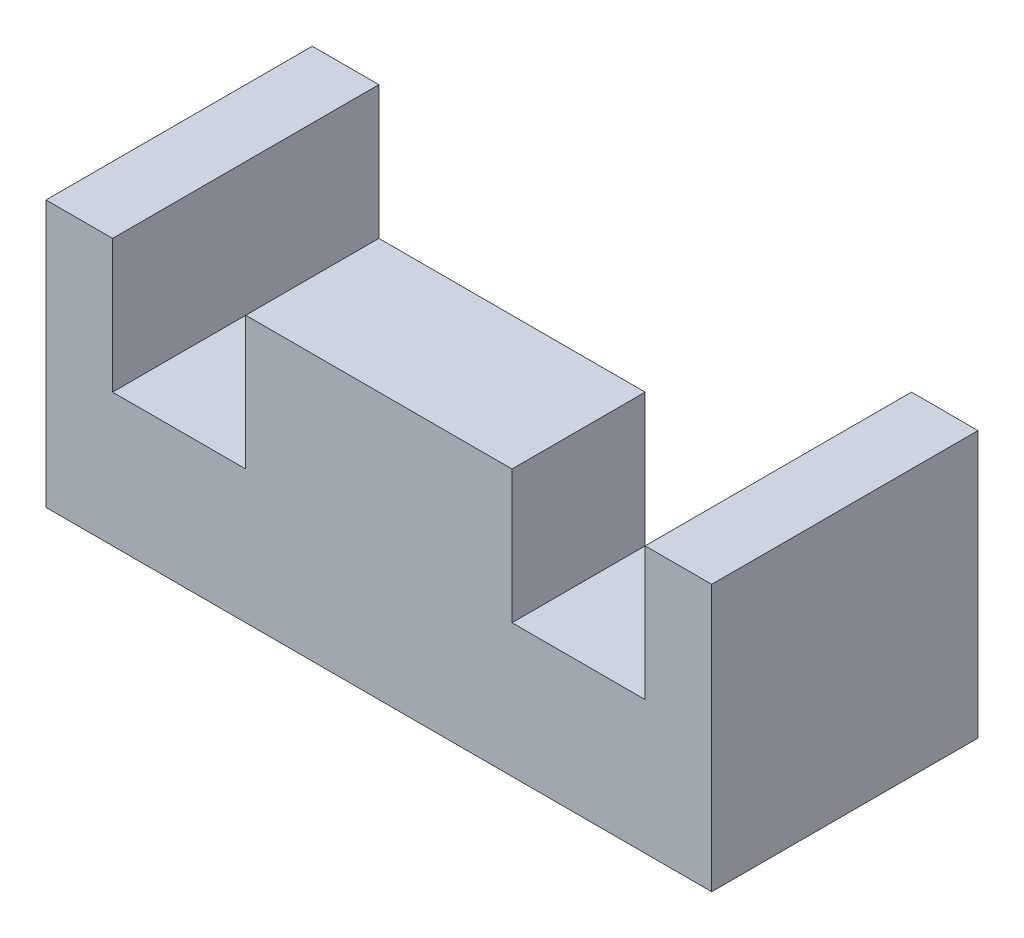
ISO-10303-21;
HEADER;
FILE_DESCRIPTION(('STEP AP214'),'2;1');
FILE_NAME('part.step','',(''),(''),'','','');
FILE_SCHEMA(('AUTOMOTIVE_DESIGN { 1 0 10303 214 1 1 1 1 }'));
ENDSEC;
DATA;
#1=APPLICATION_CONTEXT('core data for automotive mechanical design processes');
#2=APPLICATION_PROTOCOL_DEFINITION('international standard','automotive_design',2000,#1);
#3=PRODUCT_CONTEXT('',#1,'mechanical');
#4=PRODUCT('Part','Part','',(#3));
#5=PRODUCT_RELATED_PRODUCT_CATEGORY('part','',(#4));
#6=PRODUCT_DEFINITION_FORMATION('','',#4);
#7=PRODUCT_DEFINITION_CONTEXT('part definition',#1,'design');
#8=PRODUCT_DEFINITION('design','',#6,#7);
#9=PRODUCT_DEFINITION_SHAPE('','',#8);
#10=(LENGTH_UNIT() NAMED_UNIT(*) SI_UNIT(.MILLI.,.METRE.));
#11=(NAMED_UNIT(*) PLANE_ANGLE_UNIT() SI_UNIT($,.RADIAN.));
#12=(NAMED_UNIT(*) SI_UNIT($,.STERADIAN.) SOLID_ANGLE_UNIT());
#13=UNCERTAINTY_MEASURE_WITH_UNIT(LENGTH_MEASURE(1.E-05),#10,'distance_accuracy_value','');
#14=(GEOMETRIC_REPRESENTATION_CONTEXT(3) GLOBAL_UNCERTAINTY_ASSIGNED_CONTEXT((#13)) GLOBAL_UNIT_ASSIGNED_CONTEXT((#10,
#11,#12)) REPRESENTATION_CONTEXT('',''));
#15=CARTESIAN_POINT('',(0.,0.,0.));
#16=DIRECTION('',(0.,0.,1.));
#17=DIRECTION('',(1.,0.,0.));
#18=AXIS2_PLACEMENT_3D('',#15,#16,#17);
#19=CARTESIAN_POINT('',(0.,0.,0.));
#20=DIRECTION('',(0.,0.,1.));
#21=DIRECTION('',(1.,0.,0.));
#22=AXIS2_PLACEMENT_3D('',#19,#20,#21);
#23=PLANE('',#22);
#24=DIRECTION('',(1.,0.,0.));
#25=VECTOR('',#24,1.);
#26=CARTESIAN_POINT('',(0.,0.,0.));
#27=LINE('',#26,#25);
#28=CARTESIAN_POINT('',(-20.,0.,0.));
#29=VERTEX_POINT('',#28);
#30=CARTESIAN_POINT('',(-10.,0.,0.));
#31=VERTEX_POINT('',#30);
#32=EDGE_CURVE('E176',#29,#31,#27,.T.);
#33=ORIENTED_EDGE('',*,*,#32,.T.);
#34=DIRECTION('',(0.,1.,0.));
#35=VECTOR('',#34,1.);
#36=CARTESIAN_POINT('',(-10.,10.,0.));
#37=LINE('',#36,#35);
#38=CARTESIAN_POINT('',(-10.,-10.,0.));
#39=VERTEX_POINT('',#38);
#40=EDGE_CURVE('E300',#39,#31,#37,.T.);
#41=ORIENTED_EDGE('',*,*,#40,.F.);
#42=DIRECTION('',(1.,0.,0.));
#43=VECTOR('',#42,1.);
#44=CARTESIAN_POINT('',(0.,-10.,0.));
#45=LINE('',#44,#43);
#46=CARTESIAN_POINT('',(-25.,-10.,0.));
#47=VERTEX_POINT('',#46);
#48=EDGE_CURVE('E186',#47,#39,#45,.T.);
#49=ORIENTED_EDGE('',*,*,#48,.F.);
#50=DIRECTION('',(0.,-1.,0.));
#51=VECTOR('',#50,1.);
#52=CARTESIAN_POINT('',(-25.,0.,0.));
#53=LINE('',#52,#51);
#54=CARTESIAN_POINT('',(-25.,10.,0.));
#55=VERTEX_POINT('',#54);
#56=EDGE_CURVE('E148',#55,#47,#53,.T.);
#57=ORIENTED_EDGE('',*,*,#56,.F.);
#58=DIRECTION('',(1.,0.,0.));
#59=VECTOR('',#58,1.);
#60=CARTESIAN_POINT('',(0.,10.,0.));
#61=LINE('',#60,#59);
#62=CARTESIAN_POINT('',(-20.,10.,0.));
#63=VERTEX_POINT('',#62);
#64=EDGE_CURVE('E168',#55,#63,#61,.T.);
#65=ORIENTED_EDGE('',*,*,#64,.T.);
#66=DIRECTION('',(0.,-1.,0.));
#67=VECTOR('',#66,1.);
#68=CARTESIAN_POINT('',(-20.,0.,0.));
#69=LINE('',#68,#67);
#70=EDGE_CURVE('E180',#63,#29,#69,.T.);
#71=ORIENTED_EDGE('',*,*,#70,.T.);
#72=EDGE_LOOP('',(#33,#41,#49,#57,#65,#71));
#73=FACE_BOUND('',#72,.T.);
#74=ADVANCED_FACE('F40',(#73),#23,.F.);
#75=CARTESIAN_POINT('',(0.,10.,20.));
#76=DIRECTION('',(0.,1.,0.));
#77=DIRECTION('',(0.,0.,1.));
#78=AXIS2_PLACEMENT_3D('',#75,#76,#77);
#79=PLANE('',#78);
#80=CARTESIAN_POINT('',(20.,10.,0.));
#81=VERTEX_POINT('',#80);
#82=CARTESIAN_POINT('',(25.,10.,0.));
#83=VERTEX_POINT('',#82);
#84=EDGE_CURVE('E163',#81,#83,#61,.T.);
#85=ORIENTED_EDGE('',*,*,#84,.F.);
#86=DIRECTION('',(0.,0.,-1.));
#87=VECTOR('',#86,1.);
#88=CARTESIAN_POINT('',(20.,10.,20.));
#89=LINE('',#88,#87);
#90=CARTESIAN_POINT('',(20.,10.,20.));
#91=VERTEX_POINT('',#90);
#92=EDGE_CURVE('E50',#91,#81,#89,.T.);
#93=ORIENTED_EDGE('',*,*,#92,.F.);
#94=DIRECTION('',(1.,0.,0.));
#95=VECTOR('',#94,1.);
#96=CARTESIAN_POINT('',(0.,10.,20.));
#97=LINE('',#96,#95);
#98=CARTESIAN_POINT('',(25.,10.,20.));
#99=VERTEX_POINT('',#98);
#100=EDGE_CURVE('E193',#91,#99,#97,.T.);
#101=ORIENTED_EDGE('',*,*,#100,.T.);
#102=DIRECTION('',(0.,0.,-1.));
#103=VECTOR('',#102,1.);
#104=CARTESIAN_POINT('',(25.,10.,20.));
#105=LINE('',#104,#103);
#106=EDGE_CURVE('E58',#99,#83,#105,.T.);
#107=ORIENTED_EDGE('',*,*,#106,.T.);
#108=EDGE_LOOP('',(#85,#93,#101,#107));
#109=FACE_BOUND('',#108,.T.);
#110=ADVANCED_FACE('F232',(#109),#79,.T.);
#111=CARTESIAN_POINT('',(20.,0.,20.));
#112=DIRECTION('',(1.,0.,0.));
#113=DIRECTION('',(0.,1.,0.));
#114=AXIS2_PLACEMENT_3D('',#111,#112,#113);
#115=PLANE('',#114);
#116=DIRECTION('',(0.,-1.,0.));
#117=VECTOR('',#116,1.);
#118=CARTESIAN_POINT('',(20.,0.,0.));
#119=LINE('',#118,#117);
#120=CARTESIAN_POINT('',(20.,0.,0.));
#121=VERTEX_POINT('',#120);
#122=EDGE_CURVE('E166',#81,#121,#119,.T.);
#123=ORIENTED_EDGE('',*,*,#122,.T.);
#124=DIRECTION('',(0.,0.,-1.));
#125=VECTOR('',#124,1.);
#126=CARTESIAN_POINT('',(20.,0.,20.));
#127=LINE('',#126,#125);
#128=CARTESIAN_POINT('',(20.,0.,20.));
#129=VERTEX_POINT('',#128);
#130=EDGE_CURVE('E222',#129,#121,#127,.T.);
#131=ORIENTED_EDGE('',*,*,#130,.F.);
#132=DIRECTION('',(0.,-1.,0.));
#133=VECTOR('',#132,1.);
#134=CARTESIAN_POINT('',(20.,0.,20.));
#135=LINE('',#134,#133);
#136=EDGE_CURVE('E228',#91,#129,#135,.T.);
#137=ORIENTED_EDGE('',*,*,#136,.F.);
#138=ORIENTED_EDGE('',*,*,#92,.T.);
#139=EDGE_LOOP('',(#123,#131,#137,#138));
#140=FACE_BOUND('',#139,.T.);
#141=ADVANCED_FACE('F42',(#140),#115,.F.);
#142=CARTESIAN_POINT('',(0.,0.,20.));
#143=DIRECTION('',(0.,1.,0.));
#144=DIRECTION('',(-1.,0.,0.));
#145=AXIS2_PLACEMENT_3D('',#142,#143,#144);
#146=PLANE('',#145);
#147=DIRECTION('',(1.,0.,0.));
#148=VECTOR('',#147,1.);
#149=CARTESIAN_POINT('',(0.,0.,0.));
#150=LINE('',#149,#148);
#151=CARTESIAN_POINT('',(9.99999999999999,0.,0.));
#152=VERTEX_POINT('',#151);
#153=EDGE_CURVE('E172',#152,#121,#150,.T.);
#154=ORIENTED_EDGE('',*,*,#153,.F.);
#155=DIRECTION('',(0.,0.,-1.));
#156=VECTOR('',#155,1.);
#157=CARTESIAN_POINT('',(9.99999999999998,0.,20.));
#158=LINE('',#157,#156);
#159=CARTESIAN_POINT('',(9.99999999999998,0.,10.));
#160=VERTEX_POINT('',#159);
#161=EDGE_CURVE('E267',#160,#152,#158,.T.);
#162=ORIENTED_EDGE('',*,*,#161,.F.);
#163=DIRECTION('',(0.,0.,-1.));
#164=VECTOR('',#163,1.);
#165=CARTESIAN_POINT('',(9.99999999999999,0.,20.));
#166=LINE('',#165,#164);
#167=CARTESIAN_POINT('',(9.99999999999999,0.,20.));
#168=VERTEX_POINT('',#167);
#169=EDGE_CURVE('E218',#168,#160,#166,.T.);
#170=ORIENTED_EDGE('',*,*,#169,.F.);
#171=DIRECTION('',(1.,0.,0.));
#172=VECTOR('',#171,1.);
#173=CARTESIAN_POINT('',(0.,0.,20.));
#174=LINE('',#173,#172);
#175=EDGE_CURVE('E313',#168,#129,#174,.T.);
#176=ORIENTED_EDGE('',*,*,#175,.T.);
#177=ORIENTED_EDGE('',*,*,#130,.T.);
#178=EDGE_LOOP('',(#154,#162,#170,#176,#177));
#179=FACE_BOUND('',#178,.T.);
#180=ADVANCED_FACE('F240',(#179),#146,.T.);
#181=CARTESIAN_POINT('',(9.99999999999999,0.,20.));
#182=DIRECTION('',(1.,0.,0.));
#183=DIRECTION('',(0.,1.,0.));
#184=AXIS2_PLACEMENT_3D('',#181,#182,#183);
#185=PLANE('',#184);
#186=DIRECTION('',(0.,-1.,0.));
#187=VECTOR('',#186,1.);
#188=CARTESIAN_POINT('',(9.99999999999998,10.,10.));
#189=LINE('',#188,#187);
#190=CARTESIAN_POINT('',(9.99999999999998,10.,10.));
#191=VERTEX_POINT('',#190);
#192=EDGE_CURVE('E281',#191,#160,#189,.T.);
#193=ORIENTED_EDGE('',*,*,#192,.F.);
#194=DIRECTION('',(0.,0.,-1.));
#195=VECTOR('',#194,1.);
#196=CARTESIAN_POINT('',(9.99999999999999,10.,20.));
#197=LINE('',#196,#195);
#198=CARTESIAN_POINT('',(9.99999999999999,10.,20.));
#199=VERTEX_POINT('',#198);
#200=EDGE_CURVE('E214',#199,#191,#197,.T.);
#201=ORIENTED_EDGE('',*,*,#200,.F.);
#202=DIRECTION('',(0.,-1.,0.));
#203=VECTOR('',#202,1.);
#204=CARTESIAN_POINT('',(9.99999999999999,0.,20.));
#205=LINE('',#204,#203);
#206=EDGE_CURVE('E317',#199,#168,#205,.T.);
#207=ORIENTED_EDGE('',*,*,#206,.T.);
#208=ORIENTED_EDGE('',*,*,#169,.T.);
#209=EDGE_LOOP('',(#193,#201,#207,#208));
#210=FACE_BOUND('',#209,.T.);
#211=ADVANCED_FACE('F248',(#210),#185,.T.);
#212=DIRECTION('',(1.,0.,0.));
#213=VECTOR('',#212,1.);
#214=CARTESIAN_POINT('',(-10.,10.,10.));
#215=LINE('',#214,#213);
#216=CARTESIAN_POINT('',(-10.,10.,10.));
#217=VERTEX_POINT('',#216);
#218=EDGE_CURVE('E289',#217,#191,#215,.T.);
#219=ORIENTED_EDGE('',*,*,#218,.F.);
#220=DIRECTION('',(0.,0.,-1.));
#221=VECTOR('',#220,1.);
#222=CARTESIAN_POINT('',(-10.,10.,20.));
#223=LINE('',#222,#221);
#224=CARTESIAN_POINT('',(-10.,10.,20.));
#225=VERTEX_POINT('',#224);
#226=EDGE_CURVE('E210',#225,#217,#223,.T.);
#227=ORIENTED_EDGE('',*,*,#226,.F.);
#228=EDGE_CURVE('E310',#225,#199,#97,.T.);
#229=ORIENTED_EDGE('',*,*,#228,.T.);
#230=ORIENTED_EDGE('',*,*,#200,.T.);
#231=EDGE_LOOP('',(#219,#227,#229,#230));
#232=FACE_BOUND('',#231,.T.);
#233=ADVANCED_FACE('F235',(#232),#79,.T.);
#234=CARTESIAN_POINT('',(-10.,0.,20.));
#235=DIRECTION('',(1.,0.,0.));
#236=DIRECTION('',(0.,1.,0.));
#237=AXIS2_PLACEMENT_3D('',#234,#235,#236);
#238=PLANE('',#237);
#239=ORIENTED_EDGE('',*,*,#226,.T.);
#240=DIRECTION('',(0.,1.,0.));
#241=VECTOR('',#240,1.);
#242=CARTESIAN_POINT('',(-10.,10.,10.));
#243=LINE('',#242,#241);
#244=CARTESIAN_POINT('',(-10.,0.,10.));
#245=VERTEX_POINT('',#244);
#246=EDGE_CURVE('E296',#245,#217,#243,.T.);
#247=ORIENTED_EDGE('',*,*,#246,.F.);
#248=DIRECTION('',(0.,0.,-1.));
#249=VECTOR('',#248,1.);
#250=CARTESIAN_POINT('',(-10.,0.,20.));
#251=LINE('',#250,#249);
#252=CARTESIAN_POINT('',(-10.,0.,20.));
#253=VERTEX_POINT('',#252);
#254=EDGE_CURVE('E206',#253,#245,#251,.T.);
#255=ORIENTED_EDGE('',*,*,#254,.F.);
#256=DIRECTION('',(0.,-1.,0.));
#257=VECTOR('',#256,1.);
#258=CARTESIAN_POINT('',(-10.,0.,20.));
#259=LINE('',#258,#257);
#260=EDGE_CURVE('E321',#225,#253,#259,.T.);
#261=ORIENTED_EDGE('',*,*,#260,.F.);
#262=EDGE_LOOP('',(#239,#247,#255,#261));
#263=FACE_BOUND('',#262,.T.);
#264=ADVANCED_FACE('F247',(#263),#238,.F.);
#265=CARTESIAN_POINT('',(0.,0.,20.));
#266=DIRECTION('',(0.,1.,0.));
#267=DIRECTION('',(-1.,0.,0.));
#268=AXIS2_PLACEMENT_3D('',#265,#266,#267);
#269=PLANE('',#268);
#270=ORIENTED_EDGE('',*,*,#32,.F.);
#271=DIRECTION('',(0.,0.,-1.));
#272=VECTOR('',#271,1.);
#273=CARTESIAN_POINT('',(-20.,0.,20.));
#274=LINE('',#273,#272);
#275=CARTESIAN_POINT('',(-20.,0.,20.));
#276=VERTEX_POINT('',#275);
#277=EDGE_CURVE('E203',#276,#29,#274,.T.);
#278=ORIENTED_EDGE('',*,*,#277,.F.);
#279=DIRECTION('',(1.,0.,0.));
#280=VECTOR('',#279,1.);
#281=CARTESIAN_POINT('',(0.,0.,20.));
#282=LINE('',#281,#280);
#283=EDGE_CURVE('E324',#276,#253,#282,.T.);
#284=ORIENTED_EDGE('',*,*,#283,.T.);
#285=ORIENTED_EDGE('',*,*,#254,.T.);
#286=DIRECTION('',(0.,0.,1.));
#287=VECTOR('',#286,1.);
#288=CARTESIAN_POINT('',(-10.,0.,20.));
#289=LINE('',#288,#287);
#290=EDGE_CURVE('E167',#31,#245,#289,.T.);
#291=ORIENTED_EDGE('',*,*,#290,.F.);
#292=EDGE_LOOP('',(#270,#278,#284,#285,#291));
#293=FACE_BOUND('',#292,.T.);
#294=ADVANCED_FACE('F257',(#293),#269,.T.);
#295=CARTESIAN_POINT('',(-20.,0.,20.));
#296=DIRECTION('',(1.,0.,0.));
#297=DIRECTION('',(0.,1.,0.));
#298=AXIS2_PLACEMENT_3D('',#295,#296,#297);
#299=PLANE('',#298);
#300=ORIENTED_EDGE('',*,*,#70,.F.);
#301=DIRECTION('',(0.,0.,-1.));
#302=VECTOR('',#301,1.);
#303=CARTESIAN_POINT('',(-20.,10.,20.));
#304=LINE('',#303,#302);
#305=CARTESIAN_POINT('',(-20.,10.,20.));
#306=VERTEX_POINT('',#305);
#307=EDGE_CURVE('E200',#306,#63,#304,.T.);
#308=ORIENTED_EDGE('',*,*,#307,.F.);
#309=DIRECTION('',(0.,-1.,0.));
#310=VECTOR('',#309,1.);
#311=CARTESIAN_POINT('',(-20.,0.,20.));
#312=LINE('',#311,#310);
#313=EDGE_CURVE('E327',#306,#276,#312,.T.);
#314=ORIENTED_EDGE('',*,*,#313,.T.);
#315=ORIENTED_EDGE('',*,*,#277,.T.);
#316=EDGE_LOOP('',(#300,#308,#314,#315));
#317=FACE_BOUND('',#316,.T.);
#318=ADVANCED_FACE('F251',(#317),#299,.T.);
#319=ORIENTED_EDGE('',*,*,#64,.F.);
#320=DIRECTION('',(0.,0.,-1.));
#321=VECTOR('',#320,1.);
#322=CARTESIAN_POINT('',(-25.,10.,20.));
#323=LINE('',#322,#321);
#324=CARTESIAN_POINT('',(-25.,10.,20.));
#325=VERTEX_POINT('',#324);
#326=EDGE_CURVE('E152',#325,#55,#323,.T.);
#327=ORIENTED_EDGE('',*,*,#326,.F.);
#328=EDGE_CURVE('E140',#325,#306,#97,.T.);
#329=ORIENTED_EDGE('',*,*,#328,.T.);
#330=ORIENTED_EDGE('',*,*,#307,.T.);
#331=EDGE_LOOP('',(#319,#327,#329,#330));
#332=FACE_BOUND('',#331,.T.);
#333=ADVANCED_FACE('F236',(#332),#79,.T.);
#334=CARTESIAN_POINT('',(-25.,0.,20.));
#335=DIRECTION('',(1.,0.,0.));
#336=DIRECTION('',(0.,0.,-1.));
#337=AXIS2_PLACEMENT_3D('',#334,#335,#336);
#338=PLANE('',#337);
#339=ORIENTED_EDGE('',*,*,#56,.T.);
#340=DIRECTION('',(0.,0.,-1.));
#341=VECTOR('',#340,1.);
#342=CARTESIAN_POINT('',(-25.,-10.,20.));
#343=LINE('',#342,#341);
#344=CARTESIAN_POINT('',(-25.,-10.,20.));
#345=VERTEX_POINT('',#344);
#346=EDGE_CURVE('E145',#345,#47,#343,.T.);
#347=ORIENTED_EDGE('',*,*,#346,.F.);
#348=DIRECTION('',(0.,-1.,0.));
#349=VECTOR('',#348,1.);
#350=CARTESIAN_POINT('',(-25.,0.,20.));
#351=LINE('',#350,#349);
#352=EDGE_CURVE('E131',#325,#345,#351,.T.);
#353=ORIENTED_EDGE('',*,*,#352,.F.);
#354=ORIENTED_EDGE('',*,*,#326,.T.);
#355=EDGE_LOOP('',(#339,#347,#353,#354));
#356=FACE_BOUND('',#355,.T.);
#357=ADVANCED_FACE('F146',(#356),#338,.F.);
#358=CARTESIAN_POINT('',(0.,-10.,20.));
#359=DIRECTION('',(0.,1.,0.));
#360=DIRECTION('',(0.,0.,1.));
#361=AXIS2_PLACEMENT_3D('',#358,#359,#360);
#362=PLANE('',#361);
#363=ORIENTED_EDGE('',*,*,#48,.T.);
#364=DIRECTION('',(0.,0.,-1.));
#365=VECTOR('',#364,1.);
#366=CARTESIAN_POINT('',(-10.,-10.,10.));
#367=LINE('',#366,#365);
#368=CARTESIAN_POINT('',(-10.,-10.,10.));
#369=VERTEX_POINT('',#368);
#370=EDGE_CURVE('E270',#369,#39,#367,.T.);
#371=ORIENTED_EDGE('',*,*,#370,.F.);
#372=DIRECTION('',(-1.,0.,0.));
#373=VECTOR('',#372,1.);
#374=CARTESIAN_POINT('',(-10.,-10.,10.));
#375=LINE('',#374,#373);
#376=CARTESIAN_POINT('',(9.99999999999998,-10.,10.));
#377=VERTEX_POINT('',#376);
#378=EDGE_CURVE('E277',#377,#369,#375,.T.);
#379=ORIENTED_EDGE('',*,*,#378,.F.);
#380=DIRECTION('',(0.,0.,-1.));
#381=VECTOR('',#380,1.);
#382=CARTESIAN_POINT('',(9.99999999999998,-10.,10.));
#383=LINE('',#382,#381);
#384=CARTESIAN_POINT('',(9.99999999999998,-10.,0.));
#385=VERTEX_POINT('',#384);
#386=EDGE_CURVE('E274',#377,#385,#383,.T.);
#387=ORIENTED_EDGE('',*,*,#386,.T.);
#388=CARTESIAN_POINT('',(25.,-10.,0.));
#389=VERTEX_POINT('',#388);
#390=EDGE_CURVE('E92',#385,#389,#45,.T.);
#391=ORIENTED_EDGE('',*,*,#390,.T.);
#392=DIRECTION('',(0.,0.,-1.));
#393=VECTOR('',#392,1.);
#394=CARTESIAN_POINT('',(25.,-10.,20.));
#395=LINE('',#394,#393);
#396=CARTESIAN_POINT('',(25.,-10.,20.));
#397=VERTEX_POINT('',#396);
#398=EDGE_CURVE('E153',#397,#389,#395,.T.);
#399=ORIENTED_EDGE('',*,*,#398,.F.);
#400=DIRECTION('',(1.,0.,0.));
#401=VECTOR('',#400,1.);
#402=CARTESIAN_POINT('',(0.,-10.,20.));
#403=LINE('',#402,#401);
#404=EDGE_CURVE('E137',#345,#397,#403,.T.);
#405=ORIENTED_EDGE('',*,*,#404,.F.);
#406=ORIENTED_EDGE('',*,*,#346,.T.);
#407=EDGE_LOOP('',(#363,#371,#379,#387,#391,#399,#405,#406));
#408=FACE_BOUND('',#407,.T.);
#409=ADVANCED_FACE('F155',(#408),#362,.F.);
#410=CARTESIAN_POINT('',(25.,0.,20.));
#411=DIRECTION('',(1.,0.,0.));
#412=DIRECTION('',(0.,0.,-1.));
#413=AXIS2_PLACEMENT_3D('',#410,#411,#412);
#414=PLANE('',#413);
#415=DIRECTION('',(0.,-1.,0.));
#416=VECTOR('',#415,1.);
#417=CARTESIAN_POINT('',(25.,0.,0.));
#418=LINE('',#417,#416);
#419=EDGE_CURVE('E189',#83,#389,#418,.T.);
#420=ORIENTED_EDGE('',*,*,#419,.F.);
#421=ORIENTED_EDGE('',*,*,#106,.F.);
#422=DIRECTION('',(0.,-1.,0.));
#423=VECTOR('',#422,1.);
#424=CARTESIAN_POINT('',(25.,0.,20.));
#425=LINE('',#424,#423);
#426=EDGE_CURVE('E157',#99,#397,#425,.T.);
#427=ORIENTED_EDGE('',*,*,#426,.T.);
#428=ORIENTED_EDGE('',*,*,#398,.T.);
#429=EDGE_LOOP('',(#420,#421,#427,#428));
#430=FACE_BOUND('',#429,.T.);
#431=ADVANCED_FACE('F430',(#430),#414,.T.);
#432=CARTESIAN_POINT('',(0.,0.,20.));
#433=DIRECTION('',(0.,0.,1.));
#434=DIRECTION('',(1.,0.,0.));
#435=AXIS2_PLACEMENT_3D('',#432,#433,#434);
#436=PLANE('',#435);
#437=ORIENTED_EDGE('',*,*,#100,.F.);
#438=ORIENTED_EDGE('',*,*,#136,.T.);
#439=ORIENTED_EDGE('',*,*,#175,.F.);
#440=ORIENTED_EDGE('',*,*,#206,.F.);
#441=ORIENTED_EDGE('',*,*,#228,.F.);
#442=ORIENTED_EDGE('',*,*,#260,.T.);
#443=ORIENTED_EDGE('',*,*,#283,.F.);
#444=ORIENTED_EDGE('',*,*,#313,.F.);
#445=ORIENTED_EDGE('',*,*,#328,.F.);
#446=ORIENTED_EDGE('',*,*,#352,.T.);
#447=ORIENTED_EDGE('',*,*,#404,.T.);
#448=ORIENTED_EDGE('',*,*,#426,.F.);
#449=EDGE_LOOP('',(#437,#438,#439,#440,#441,#442,#443,#444,#445,#446,#447,#448));
#450=FACE_BOUND('',#449,.T.);
#451=ADVANCED_FACE('F134',(#450),#436,.T.);
#452=ORIENTED_EDGE('',*,*,#390,.F.);
#453=DIRECTION('',(0.,1.,0.));
#454=VECTOR('',#453,1.);
#455=CARTESIAN_POINT('',(9.99999999999998,0.,0.));
#456=LINE('',#455,#454);
#457=EDGE_CURVE('E11',#385,#152,#456,.T.);
#458=ORIENTED_EDGE('',*,*,#457,.T.);
#459=ORIENTED_EDGE('',*,*,#153,.T.);
#460=ORIENTED_EDGE('',*,*,#122,.F.);
#461=ORIENTED_EDGE('',*,*,#84,.T.);
#462=ORIENTED_EDGE('',*,*,#419,.T.);
#463=EDGE_LOOP('',(#452,#458,#459,#460,#461,#462));
#464=FACE_BOUND('',#463,.T.);
#465=ADVANCED_FACE('F230',(#464),#23,.F.);
#466=CARTESIAN_POINT('',(-10.,10.,10.));
#467=DIRECTION('',(-1.,0.,0.));
#468=DIRECTION('',(0.,0.,1.));
#469=AXIS2_PLACEMENT_3D('',#466,#467,#468);
#470=PLANE('',#469);
#471=ORIENTED_EDGE('',*,*,#290,.T.);
#472=EDGE_CURVE('E292',#369,#245,#243,.T.);
#473=ORIENTED_EDGE('',*,*,#472,.F.);
#474=ORIENTED_EDGE('',*,*,#370,.T.);
#475=ORIENTED_EDGE('',*,*,#40,.T.);
#476=EDGE_LOOP('',(#471,#473,#474,#475));
#477=FACE_BOUND('',#476,.T.);
#478=ADVANCED_FACE('F365',(#477),#470,.F.);
#479=CARTESIAN_POINT('',(9.99999999999998,10.,10.));
#480=DIRECTION('',(1.,0.,0.));
#481=DIRECTION('',(0.,0.,-1.));
#482=AXIS2_PLACEMENT_3D('',#479,#480,#481);
#483=PLANE('',#482);
#484=ORIENTED_EDGE('',*,*,#161,.T.);
#485=ORIENTED_EDGE('',*,*,#457,.F.);
#486=ORIENTED_EDGE('',*,*,#386,.F.);
#487=EDGE_CURVE('E285',#160,#377,#189,.T.);
#488=ORIENTED_EDGE('',*,*,#487,.F.);
#489=EDGE_LOOP('',(#484,#485,#486,#488));
#490=FACE_BOUND('',#489,.T.);
#491=ADVANCED_FACE('F357',(#490),#483,.F.);
#492=CARTESIAN_POINT('',(0.,0.,10.));
#493=DIRECTION('',(0.,0.,1.));
#494=DIRECTION('',(1.,0.,0.));
#495=AXIS2_PLACEMENT_3D('',#492,#493,#494);
#496=PLANE('',#495);
#497=ORIENTED_EDGE('',*,*,#472,.T.);
#498=ORIENTED_EDGE('',*,*,#246,.T.);
#499=ORIENTED_EDGE('',*,*,#218,.T.);
#500=ORIENTED_EDGE('',*,*,#192,.T.);
#501=ORIENTED_EDGE('',*,*,#487,.T.);
#502=ORIENTED_EDGE('',*,*,#378,.T.);
#503=EDGE_LOOP('',(#497,#498,#499,#500,#501,#502));
#504=FACE_BOUND('',#503,.T.);
#505=ADVANCED_FACE('F349',(#504),#496,.F.);
#506=CLOSED_SHELL('',(#74,#110,#141,#180,#211,#233,#264,#294,#318,#333,#357,#409,#431,#451,#465,
#478,#491,#505));
#507=MANIFOLD_SOLID_BREP('B2',#506);
#508=ADVANCED_BREP_SHAPE_REPRESENTATION('',(#18,#507),#14);
#509=SHAPE_DEFINITION_REPRESENTATION(#9,#508);
ENDSEC;
END-ISO-10303-21;
